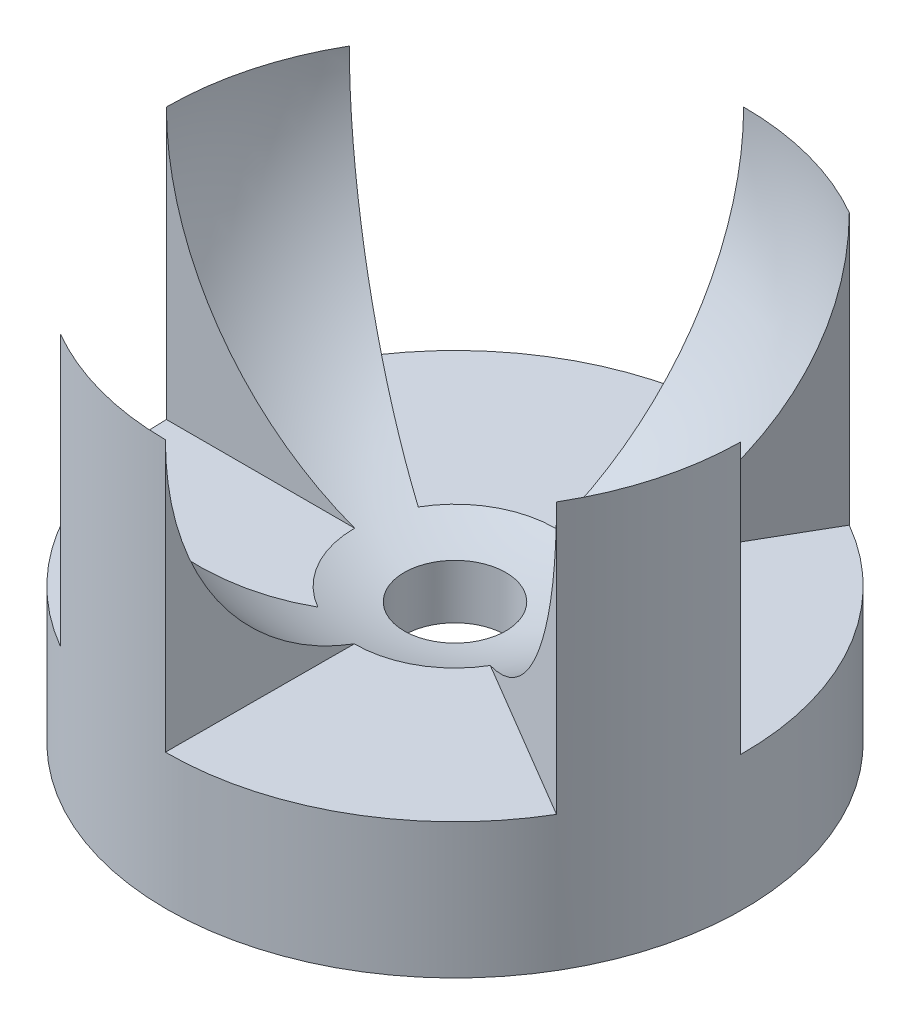
ISO-10303-21;
HEADER;
FILE_DESCRIPTION(('STEP AP214'),'2;1');
FILE_NAME('part.step','',(''),(''),'','','');
FILE_SCHEMA(('AUTOMOTIVE_DESIGN { 1 0 10303 214 1 1 1 1 }'));
ENDSEC;
DATA;
#1=APPLICATION_CONTEXT('core data for automotive mechanical design processes');
#2=APPLICATION_PROTOCOL_DEFINITION('international standard','automotive_design',2000,#1);
#3=PRODUCT_CONTEXT('',#1,'mechanical');
#4=PRODUCT('Part','Part','',(#3));
#5=PRODUCT_RELATED_PRODUCT_CATEGORY('part','',(#4));
#6=PRODUCT_DEFINITION_FORMATION('','',#4);
#7=PRODUCT_DEFINITION_CONTEXT('part definition',#1,'design');
#8=PRODUCT_DEFINITION('design','',#6,#7);
#9=PRODUCT_DEFINITION_SHAPE('','',#8);
#10=(LENGTH_UNIT() NAMED_UNIT(*) SI_UNIT(.MILLI.,.METRE.));
#11=(NAMED_UNIT(*) PLANE_ANGLE_UNIT() SI_UNIT($,.RADIAN.));
#12=(NAMED_UNIT(*) SI_UNIT($,.STERADIAN.) SOLID_ANGLE_UNIT());
#13=UNCERTAINTY_MEASURE_WITH_UNIT(LENGTH_MEASURE(1.E-05),#10,'distance_accuracy_value','');
#14=(GEOMETRIC_REPRESENTATION_CONTEXT(3) GLOBAL_UNCERTAINTY_ASSIGNED_CONTEXT((#13)) GLOBAL_UNIT_ASSIGNED_CONTEXT((#10,
#11,#12)) REPRESENTATION_CONTEXT('',''));
#15=CARTESIAN_POINT('',(0.,0.,0.));
#16=DIRECTION('',(0.,0.,1.));
#17=DIRECTION('',(1.,0.,0.));
#18=AXIS2_PLACEMENT_3D('',#15,#16,#17);
#19=CARTESIAN_POINT('',(0.,40.,0.));
#20=DIRECTION('',(0.,1.,0.));
#21=DIRECTION('',(0.,0.,1.));
#22=AXIS2_PLACEMENT_3D('',#19,#20,#21);
#23=PLANE('',#22);
#24=CARTESIAN_POINT('',(0.,40.,0.));
#25=DIRECTION('',(0.,1.,0.));
#26=DIRECTION('',(0.,0.,1.));
#27=AXIS2_PLACEMENT_3D('',#24,#25,#26);
#28=CIRCLE('',#27,29.6699868770734);
#29=CARTESIAN_POINT('',(29.669074385938,40.,0.232693720123943));
#30=VERTEX_POINT('',#29);
#31=CARTESIAN_POINT('',(14.8349934385367,40.,-25.6949623654964));
#32=VERTEX_POINT('',#31);
#33=EDGE_CURVE('E227',#30,#32,#28,.T.);
#34=ORIENTED_EDGE('',*,*,#33,.F.);
#35=DIRECTION('',(0.999930027740241,0.,0.0118296079140797));
#36=VECTOR('',#35,1.);
#37=CARTESIAN_POINT('',(0.00139939623400857,40.,-0.118287801696819));
#38=LINE('',#37,#36);
#39=CARTESIAN_POINT('',(85.3200686644835,40.,0.89106923049006));
#40=VERTEX_POINT('',#39);
#41=EDGE_CURVE('E36',#30,#40,#38,.T.);
#42=ORIENTED_EDGE('',*,*,#41,.T.);
#43=CARTESIAN_POINT('',(0.,40.,0.));
#44=DIRECTION('',(0.,1.,0.));
#45=DIRECTION('',(0.,0.,1.));
#46=AXIS2_PLACEMENT_3D('',#43,#44,#45);
#47=CIRCLE('',#46,85.3247216302855);
#48=CARTESIAN_POINT('',(42.6623608151428,40.,-73.8933765026628));
#49=VERTEX_POINT('',#48);
#50=EDGE_CURVE('E11',#40,#49,#47,.T.);
#51=ORIENTED_EDGE('',*,*,#50,.T.);
#52=DIRECTION('',(0.500000000000001,0.,-0.866025403784438));
#53=VECTOR('',#52,1.);
#54=CARTESIAN_POINT('',(5.,40.,-8.66025403784439));
#55=LINE('',#54,#53);
#56=EDGE_CURVE('E50',#32,#49,#55,.T.);
#57=ORIENTED_EDGE('',*,*,#56,.F.);
#58=EDGE_LOOP('',(#34,#42,#51,#57));
#59=FACE_BOUND('',#58,.T.);
#60=ADVANCED_FACE('F32',(#59),#23,.T.);
#61=CARTESIAN_POINT('',(0.,40.,-29.6699868770734));
#62=VERTEX_POINT('',#61);
#63=CARTESIAN_POINT('',(-25.6949623654964,40.,-14.8349934385367));
#64=VERTEX_POINT('',#63);
#65=EDGE_CURVE('E232',#62,#64,#28,.T.);
#66=ORIENTED_EDGE('',*,*,#65,.F.);
#67=DIRECTION('',(0.,0.,-1.));
#68=VECTOR('',#67,1.);
#69=CARTESIAN_POINT('',(0.,40.,-10.));
#70=LINE('',#69,#68);
#71=CARTESIAN_POINT('',(0.,40.,-85.3247216302855));
#72=VERTEX_POINT('',#71);
#73=EDGE_CURVE('E210',#62,#72,#70,.T.);
#74=ORIENTED_EDGE('',*,*,#73,.T.);
#75=CARTESIAN_POINT('',(-73.8933765026628,40.,-42.6623608151428));
#76=VERTEX_POINT('',#75);
#77=EDGE_CURVE('E42',#72,#76,#47,.T.);
#78=ORIENTED_EDGE('',*,*,#77,.T.);
#79=DIRECTION('',(0.866025403784438,0.,0.500000000000001));
#80=VECTOR('',#79,1.);
#81=CARTESIAN_POINT('',(-73.8933765026627,40.,-42.6623608151428));
#82=LINE('',#81,#80);
#83=EDGE_CURVE('E188',#76,#64,#82,.T.);
#84=ORIENTED_EDGE('',*,*,#83,.T.);
#85=EDGE_LOOP('',(#66,#74,#78,#84));
#86=FACE_BOUND('',#85,.T.);
#87=ADVANCED_FACE('F279',(#86),#23,.T.);
#88=CARTESIAN_POINT('',(-29.6699868770734,40.,0.));
#89=VERTEX_POINT('',#88);
#90=CARTESIAN_POINT('',(-14.9230697733276,40.,25.6439097999136));
#91=VERTEX_POINT('',#90);
#92=EDGE_CURVE('E222',#89,#91,#28,.T.);
#93=ORIENTED_EDGE('',*,*,#92,.F.);
#94=DIRECTION('',(-1.,0.,0.));
#95=VECTOR('',#94,1.);
#96=CARTESIAN_POINT('',(-10.,40.,0.));
#97=LINE('',#96,#95);
#98=CARTESIAN_POINT('',(-85.3247216302855,40.,0.));
#99=VERTEX_POINT('',#98);
#100=EDGE_CURVE('E178',#89,#99,#97,.T.);
#101=ORIENTED_EDGE('',*,*,#100,.T.);
#102=CARTESIAN_POINT('',(-42.9156500659734,40.,73.7465599245187));
#103=VERTEX_POINT('',#102);
#104=EDGE_CURVE('E164',#99,#103,#47,.T.);
#105=ORIENTED_EDGE('',*,*,#104,.T.);
#106=DIRECTION('',(0.502968532987757,0.,-0.864304723361005));
#107=VECTOR('',#106,1.);
#108=CARTESIAN_POINT('',(0.,40.,0.));
#109=LINE('',#108,#107);
#110=EDGE_CURVE('E176',#103,#91,#109,.T.);
#111=ORIENTED_EDGE('',*,*,#110,.T.);
#112=EDGE_LOOP('',(#93,#101,#105,#111));
#113=FACE_BOUND('',#112,.T.);
#114=ADVANCED_FACE('F174',(#113),#23,.T.);
#115=CARTESIAN_POINT('',(-0.101802626192548,40.,29.6698122257456));
#116=VERTEX_POINT('',#115);
#117=CARTESIAN_POINT('',(25.5386352927101,40.,15.1025239172679));
#118=VERTEX_POINT('',#117);
#119=EDGE_CURVE('E131',#116,#118,#28,.T.);
#120=ORIENTED_EDGE('',*,*,#119,.F.);
#121=DIRECTION('',(0.0034311651910845,0.,-0.99999411353539));
#122=VECTOR('',#121,1.);
#123=CARTESIAN_POINT('',(0.,40.,0.));
#124=LINE('',#123,#122);
#125=CARTESIAN_POINT('',(-0.29276321479681,40.,85.3242193693313));
#126=VERTEX_POINT('',#125);
#127=EDGE_CURVE('E192',#126,#116,#124,.T.);
#128=ORIENTED_EDGE('',*,*,#127,.F.);
#129=CARTESIAN_POINT('',(73.4438123008303,40.,43.4317229223769));
#130=VERTEX_POINT('',#129);
#131=EDGE_CURVE('E162',#126,#130,#47,.T.);
#132=ORIENTED_EDGE('',*,*,#131,.T.);
#133=DIRECTION('',(-0.860756541569095,0.,-0.509016872162418));
#134=VECTOR('',#133,1.);
#135=CARTESIAN_POINT('',(0.,40.,0.));
#136=LINE('',#135,#134);
#137=EDGE_CURVE('E140',#130,#118,#136,.T.);
#138=ORIENTED_EDGE('',*,*,#137,.T.);
#139=EDGE_LOOP('',(#120,#128,#132,#138));
#140=FACE_BOUND('',#139,.T.);
#141=ADVANCED_FACE('F271',(#140),#23,.T.);
#142=CARTESIAN_POINT('',(0.,40.,0.));
#143=DIRECTION('',(0.,-1.,0.));
#144=DIRECTION('',(0.,0.,-1.));
#145=AXIS2_PLACEMENT_3D('',#142,#143,#144);
#146=CYLINDRICAL_SURFACE('',#145,85.3247216302855);
#147=ORIENTED_EDGE('',*,*,#50,.F.);
#148=DIRECTION('',(0.,-1.,0.));
#149=VECTOR('',#148,1.);
#150=CARTESIAN_POINT('',(85.3200686644835,120.,0.89106923049006));
#151=LINE('',#150,#149);
#152=CARTESIAN_POINT('',(85.3200686644835,120.,0.89106923049006));
#153=VERTEX_POINT('',#152);
#154=EDGE_CURVE('E143',#153,#40,#151,.T.);
#155=ORIENTED_EDGE('',*,*,#154,.F.);
#156=CARTESIAN_POINT('',(0.,120.,0.));
#157=DIRECTION('',(0.,1.,0.));
#158=DIRECTION('',(0.,0.,1.));
#159=AXIS2_PLACEMENT_3D('',#156,#157,#158);
#160=CIRCLE('',#159,85.3247216302855);
#161=CARTESIAN_POINT('',(73.4438123008303,120.,43.4317229223769));
#162=VERTEX_POINT('',#161);
#163=EDGE_CURVE('E128',#162,#153,#160,.T.);
#164=ORIENTED_EDGE('',*,*,#163,.F.);
#165=DIRECTION('',(0.,-1.,0.));
#166=VECTOR('',#165,1.);
#167=CARTESIAN_POINT('',(73.4438123008302,120.,43.4317229223769));
#168=LINE('',#167,#166);
#169=EDGE_CURVE('E138',#162,#130,#168,.T.);
#170=ORIENTED_EDGE('',*,*,#169,.T.);
#171=ORIENTED_EDGE('',*,*,#131,.F.);
#172=DIRECTION('',(0.,-1.,0.));
#173=VECTOR('',#172,1.);
#174=CARTESIAN_POINT('',(-0.29276321479681,120.,85.3242193693313));
#175=LINE('',#174,#173);
#176=CARTESIAN_POINT('',(-0.29276321479681,120.,85.3242193693313));
#177=VERTEX_POINT('',#176);
#178=EDGE_CURVE('E187',#177,#126,#175,.T.);
#179=ORIENTED_EDGE('',*,*,#178,.F.);
#180=CARTESIAN_POINT('',(0.,120.,0.));
#181=DIRECTION('',(0.,1.,0.));
#182=DIRECTION('',(0.,0.,1.));
#183=AXIS2_PLACEMENT_3D('',#180,#181,#182);
#184=CIRCLE('',#183,85.3247216302855);
#185=CARTESIAN_POINT('',(-42.9156500659734,120.,73.7465599245187));
#186=VERTEX_POINT('',#185);
#187=EDGE_CURVE('E154',#186,#177,#184,.T.);
#188=ORIENTED_EDGE('',*,*,#187,.F.);
#189=DIRECTION('',(0.,-1.,0.));
#190=VECTOR('',#189,1.);
#191=CARTESIAN_POINT('',(-42.9156500659734,120.,73.7465599245187));
#192=LINE('',#191,#190);
#193=EDGE_CURVE('E183',#186,#103,#192,.T.);
#194=ORIENTED_EDGE('',*,*,#193,.T.);
#195=ORIENTED_EDGE('',*,*,#104,.F.);
#196=DIRECTION('',(0.,-1.,0.));
#197=VECTOR('',#196,1.);
#198=CARTESIAN_POINT('',(-85.3247216302855,120.,0.));
#199=LINE('',#198,#197);
#200=CARTESIAN_POINT('',(-85.3247216302855,120.,0.));
#201=VERTEX_POINT('',#200);
#202=EDGE_CURVE('E201',#201,#99,#199,.T.);
#203=ORIENTED_EDGE('',*,*,#202,.F.);
#204=CARTESIAN_POINT('',(0.,120.,0.));
#205=DIRECTION('',(0.,-1.,0.));
#206=DIRECTION('',(0.,0.,-1.));
#207=AXIS2_PLACEMENT_3D('',#204,#205,#206);
#208=CIRCLE('',#207,85.3247216302855);
#209=CARTESIAN_POINT('',(-73.8933765026628,120.,-42.6623608151428));
#210=VERTEX_POINT('',#209);
#211=EDGE_CURVE('E198',#201,#210,#208,.T.);
#212=ORIENTED_EDGE('',*,*,#211,.T.);
#213=DIRECTION('',(0.,-1.,0.));
#214=VECTOR('',#213,1.);
#215=CARTESIAN_POINT('',(-73.8933765026628,120.,-42.6623608151428));
#216=LINE('',#215,#214);
#217=EDGE_CURVE('E205',#210,#76,#216,.T.);
#218=ORIENTED_EDGE('',*,*,#217,.T.);
#219=ORIENTED_EDGE('',*,*,#77,.F.);
#220=DIRECTION('',(0.,-1.,0.));
#221=VECTOR('',#220,1.);
#222=CARTESIAN_POINT('',(0.,120.,-85.3247216302855));
#223=LINE('',#222,#221);
#224=CARTESIAN_POINT('',(0.,120.,-85.3247216302855));
#225=VERTEX_POINT('',#224);
#226=EDGE_CURVE('E211',#225,#72,#223,.T.);
#227=ORIENTED_EDGE('',*,*,#226,.F.);
#228=CARTESIAN_POINT('',(0.,120.,0.));
#229=DIRECTION('',(0.,-1.,0.));
#230=DIRECTION('',(0.,0.,-1.));
#231=AXIS2_PLACEMENT_3D('',#228,#229,#230);
#232=CIRCLE('',#231,85.3247216302855);
#233=CARTESIAN_POINT('',(42.6623608151428,120.,-73.8933765026627));
#234=VERTEX_POINT('',#233);
#235=EDGE_CURVE('E207',#225,#234,#232,.T.);
#236=ORIENTED_EDGE('',*,*,#235,.T.);
#237=DIRECTION('',(0.,-1.,0.));
#238=VECTOR('',#237,1.);
#239=CARTESIAN_POINT('',(42.6623608151428,120.,-73.8933765026627));
#240=LINE('',#239,#238);
#241=EDGE_CURVE('E135',#234,#49,#240,.T.);
#242=ORIENTED_EDGE('',*,*,#241,.T.);
#243=EDGE_LOOP('',(#147,#155,#164,#170,#171,#179,#188,#194,#195,#203,#212,#218,#219,#227,#236,#242));
#244=FACE_BOUND('',#243,.T.);
#245=CARTESIAN_POINT('',(0.,0.,0.));
#246=DIRECTION('',(0.,1.,0.));
#247=DIRECTION('',(0.,0.,1.));
#248=AXIS2_PLACEMENT_3D('',#245,#246,#247);
#249=CIRCLE('',#248,85.3247216302855);
#250=CARTESIAN_POINT('',(0.,0.,85.3247216302855));
#251=VERTEX_POINT('',#250);
#252=EDGE_CURVE('E142',#251,#251,#249,.T.);
#253=ORIENTED_EDGE('',*,*,#252,.T.);
#254=EDGE_LOOP('',(#253));
#255=FACE_BOUND('',#254,.T.);
#256=ADVANCED_FACE('F34',(#244,#255),#146,.T.);
#257=CARTESIAN_POINT('',(0.,0.,0.));
#258=DIRECTION('',(0.,1.,0.));
#259=DIRECTION('',(0.,0.,1.));
#260=AXIS2_PLACEMENT_3D('',#257,#258,#259);
#261=PLANE('',#260);
#262=CARTESIAN_POINT('',(0.,0.,0.));
#263=DIRECTION('',(0.,-1.,0.));
#264=DIRECTION('',(0.,0.,-1.));
#265=AXIS2_PLACEMENT_3D('',#262,#263,#264);
#266=CIRCLE('',#265,50.);
#267=CARTESIAN_POINT('',(0.,0.,-50.));
#268=VERTEX_POINT('',#267);
#269=EDGE_CURVE('E237',#268,#268,#266,.T.);
#270=ORIENTED_EDGE('',*,*,#269,.F.);
#271=EDGE_LOOP('',(#270));
#272=FACE_BOUND('',#271,.T.);
#273=ORIENTED_EDGE('',*,*,#252,.F.);
#274=EDGE_LOOP('',(#273));
#275=FACE_BOUND('',#274,.T.);
#276=ADVANCED_FACE('F264',(#272,#275),#261,.F.);
#277=CARTESIAN_POINT('',(0.00139939623400857,120.,-0.118287801696819));
#278=DIRECTION('',(0.0118296079140797,0.,-0.999930027740241));
#279=DIRECTION('',(-0.999930027740241,0.,-0.0118296079140797));
#280=AXIS2_PLACEMENT_3D('',#277,#278,#279);
#281=PLANE('',#280);
#282=CARTESIAN_POINT('',(0.00139939623400857,120.,-0.118287801696819));
#283=DIRECTION('',(0.0118296079140797,0.,-0.999930027740241));
#284=DIRECTION('',(-0.999930027740241,0.,-0.0118296079140797));
#285=AXIS2_PLACEMENT_3D('',#282,#283,#284);
#286=CIRCLE('',#285,85.3246396260972);
#287=EDGE_CURVE('E225',#153,#30,#286,.T.);
#288=ORIENTED_EDGE('',*,*,#287,.F.);
#289=ORIENTED_EDGE('',*,*,#154,.T.);
#290=ORIENTED_EDGE('',*,*,#41,.F.);
#291=EDGE_LOOP('',(#288,#289,#290));
#292=FACE_BOUND('',#291,.T.);
#293=ADVANCED_FACE('F267',(#292),#281,.T.);
#294=CARTESIAN_POINT('',(0.,120.,0.));
#295=DIRECTION('',(-0.509016872162418,0.,0.860756541569095));
#296=DIRECTION('',(0.860756541569095,0.,0.509016872162418));
#297=AXIS2_PLACEMENT_3D('',#294,#295,#296);
#298=PLANE('',#297);
#299=CARTESIAN_POINT('',(0.,120.,0.));
#300=DIRECTION('',(-0.509016872162418,0.,0.860756541569095));
#301=DIRECTION('',(0.860756541569095,0.,0.509016872162418));
#302=AXIS2_PLACEMENT_3D('',#299,#300,#301);
#303=CIRCLE('',#302,85.3247216302855);
#304=EDGE_CURVE('E124',#118,#162,#303,.T.);
#305=ORIENTED_EDGE('',*,*,#304,.F.);
#306=ORIENTED_EDGE('',*,*,#137,.F.);
#307=ORIENTED_EDGE('',*,*,#169,.F.);
#308=EDGE_LOOP('',(#305,#306,#307));
#309=FACE_BOUND('',#308,.T.);
#310=ADVANCED_FACE('F139',(#309),#298,.T.);
#311=CARTESIAN_POINT('',(0.,120.,0.));
#312=DIRECTION('',(-0.99999411353539,0.,-0.0034311651910845));
#313=DIRECTION('',(-0.0034311651910845,0.,0.99999411353539));
#314=AXIS2_PLACEMENT_3D('',#311,#312,#313);
#315=PLANE('',#314);
#316=ORIENTED_EDGE('',*,*,#127,.T.);
#317=CARTESIAN_POINT('',(0.,120.,0.));
#318=DIRECTION('',(-0.99999411353539,0.,-0.0034311651910845));
#319=DIRECTION('',(-0.0034311651910845,0.,0.99999411353539));
#320=AXIS2_PLACEMENT_3D('',#317,#318,#319);
#321=CIRCLE('',#320,85.3247216302855);
#322=EDGE_CURVE('E218',#116,#177,#321,.T.);
#323=ORIENTED_EDGE('',*,*,#322,.T.);
#324=ORIENTED_EDGE('',*,*,#178,.T.);
#325=EDGE_LOOP('',(#316,#323,#324));
#326=FACE_BOUND('',#325,.T.);
#327=ADVANCED_FACE('F291',(#326),#315,.F.);
#328=CARTESIAN_POINT('',(0.,120.,0.));
#329=DIRECTION('',(-0.864304723361005,0.,-0.502968532987757));
#330=DIRECTION('',(-0.502968532987757,0.,0.864304723361005));
#331=AXIS2_PLACEMENT_3D('',#328,#329,#330);
#332=PLANE('',#331);
#333=CARTESIAN_POINT('',(0.,120.,0.));
#334=DIRECTION('',(-0.864304723361005,0.,-0.502968532987757));
#335=DIRECTION('',(-0.502968532987757,0.,0.864304723361005));
#336=AXIS2_PLACEMENT_3D('',#333,#334,#335);
#337=CIRCLE('',#336,85.3247216302855);
#338=EDGE_CURVE('E191',#91,#186,#337,.T.);
#339=ORIENTED_EDGE('',*,*,#338,.F.);
#340=ORIENTED_EDGE('',*,*,#110,.F.);
#341=ORIENTED_EDGE('',*,*,#193,.F.);
#342=EDGE_LOOP('',(#339,#340,#341));
#343=FACE_BOUND('',#342,.T.);
#344=ADVANCED_FACE('F190',(#343),#332,.T.);
#345=CARTESIAN_POINT('',(-73.8933765026627,120.,-42.6623608151428));
#346=DIRECTION('',(0.500000000000001,0.,-0.866025403784438));
#347=DIRECTION('',(-0.866025403784438,0.,-0.500000000000001));
#348=AXIS2_PLACEMENT_3D('',#345,#346,#347);
#349=PLANE('',#348);
#350=CARTESIAN_POINT('',(0.,120.,0.));
#351=DIRECTION('',(0.500000000000001,0.,-0.866025403784438));
#352=DIRECTION('',(-0.866025403784438,0.,-0.500000000000001));
#353=AXIS2_PLACEMENT_3D('',#350,#351,#352);
#354=CIRCLE('',#353,85.3247216302855);
#355=EDGE_CURVE('E230',#64,#210,#354,.T.);
#356=ORIENTED_EDGE('',*,*,#355,.F.);
#357=ORIENTED_EDGE('',*,*,#83,.F.);
#358=ORIENTED_EDGE('',*,*,#217,.F.);
#359=EDGE_LOOP('',(#356,#357,#358));
#360=FACE_BOUND('',#359,.T.);
#361=ADVANCED_FACE('F294',(#360),#349,.T.);
#362=CARTESIAN_POINT('',(-10.,120.,0.));
#363=DIRECTION('',(0.,0.,1.));
#364=DIRECTION('',(1.,0.,0.));
#365=AXIS2_PLACEMENT_3D('',#362,#363,#364);
#366=PLANE('',#365);
#367=CARTESIAN_POINT('',(0.,120.,0.));
#368=DIRECTION('',(0.,0.,1.));
#369=DIRECTION('',(1.,0.,0.));
#370=AXIS2_PLACEMENT_3D('',#367,#368,#369);
#371=CIRCLE('',#370,85.3247216302855);
#372=EDGE_CURVE('E223',#201,#89,#371,.T.);
#373=ORIENTED_EDGE('',*,*,#372,.F.);
#374=ORIENTED_EDGE('',*,*,#202,.T.);
#375=ORIENTED_EDGE('',*,*,#100,.F.);
#376=EDGE_LOOP('',(#373,#374,#375));
#377=FACE_BOUND('',#376,.T.);
#378=ADVANCED_FACE('F298',(#377),#366,.T.);
#379=CARTESIAN_POINT('',(5.,120.,-8.66025403784439));
#380=DIRECTION('',(-0.866025403784438,0.,-0.500000000000001));
#381=DIRECTION('',(-0.500000000000001,0.,0.866025403784438));
#382=AXIS2_PLACEMENT_3D('',#379,#380,#381);
#383=PLANE('',#382);
#384=ORIENTED_EDGE('',*,*,#241,.F.);
#385=CARTESIAN_POINT('',(0.,120.,0.));
#386=DIRECTION('',(-0.866025403784438,0.,-0.500000000000001));
#387=DIRECTION('',(-0.500000000000001,0.,0.866025403784438));
#388=AXIS2_PLACEMENT_3D('',#385,#386,#387);
#389=CIRCLE('',#388,85.3247216302855);
#390=EDGE_CURVE('E228',#234,#32,#389,.T.);
#391=ORIENTED_EDGE('',*,*,#390,.T.);
#392=ORIENTED_EDGE('',*,*,#56,.T.);
#393=EDGE_LOOP('',(#384,#391,#392));
#394=FACE_BOUND('',#393,.T.);
#395=ADVANCED_FACE('F301',(#394),#383,.F.);
#396=CARTESIAN_POINT('',(0.,120.,-10.));
#397=DIRECTION('',(-1.,0.,0.));
#398=DIRECTION('',(0.,0.,1.));
#399=AXIS2_PLACEMENT_3D('',#396,#397,#398);
#400=PLANE('',#399);
#401=CARTESIAN_POINT('',(0.,120.,0.));
#402=DIRECTION('',(-1.,0.,0.));
#403=DIRECTION('',(0.,0.,1.));
#404=AXIS2_PLACEMENT_3D('',#401,#402,#403);
#405=CIRCLE('',#404,85.3247216302855);
#406=EDGE_CURVE('E234',#225,#62,#405,.T.);
#407=ORIENTED_EDGE('',*,*,#406,.F.);
#408=ORIENTED_EDGE('',*,*,#226,.T.);
#409=ORIENTED_EDGE('',*,*,#73,.F.);
#410=EDGE_LOOP('',(#407,#408,#409));
#411=FACE_BOUND('',#410,.T.);
#412=ADVANCED_FACE('F306',(#411),#400,.T.);
#413=CARTESIAN_POINT('',(0.,120.,0.));
#414=DIRECTION('',(0.,1.,0.));
#415=DIRECTION('',(0.500000000000001,0.,-0.866025403784438));
#416=AXIS2_PLACEMENT_3D('',#413,#414,#415);
#417=SPHERICAL_SURFACE('',#416,85.3247216302855);
#418=CARTESIAN_POINT('',(0.,36.0041184266413,0.));
#419=DIRECTION('',(0.,1.,0.));
#420=DIRECTION('',(0.,0.,1.));
#421=AXIS2_PLACEMENT_3D('',#418,#419,#420);
#422=CIRCLE('',#421,15.);
#423=CARTESIAN_POINT('',(0.,36.0041184266413,15.));
#424=VERTEX_POINT('',#423);
#425=EDGE_CURVE('E240',#424,#424,#422,.F.);
#426=ORIENTED_EDGE('',*,*,#425,.T.);
#427=EDGE_LOOP('',(#426));
#428=FACE_BOUND('',#427,.T.);
#429=ORIENTED_EDGE('',*,*,#304,.T.);
#430=ORIENTED_EDGE('',*,*,#163,.T.);
#431=ORIENTED_EDGE('',*,*,#287,.T.);
#432=ORIENTED_EDGE('',*,*,#33,.T.);
#433=ORIENTED_EDGE('',*,*,#390,.F.);
#434=ORIENTED_EDGE('',*,*,#235,.F.);
#435=ORIENTED_EDGE('',*,*,#406,.T.);
#436=ORIENTED_EDGE('',*,*,#65,.T.);
#437=ORIENTED_EDGE('',*,*,#355,.T.);
#438=ORIENTED_EDGE('',*,*,#211,.F.);
#439=ORIENTED_EDGE('',*,*,#372,.T.);
#440=ORIENTED_EDGE('',*,*,#92,.T.);
#441=ORIENTED_EDGE('',*,*,#338,.T.);
#442=ORIENTED_EDGE('',*,*,#187,.T.);
#443=ORIENTED_EDGE('',*,*,#322,.F.);
#444=ORIENTED_EDGE('',*,*,#119,.T.);
#445=EDGE_LOOP('',(#429,#430,#431,#432,#433,#434,#435,#436,#437,#438,#439,#440,#441,#442,#443,#444));
#446=FACE_BOUND('',#445,.T.);
#447=ADVANCED_FACE('F126',(#428,#446),#417,.F.);
#448=CARTESIAN_POINT('',(0.,20.,0.));
#449=DIRECTION('',(0.,-1.,0.));
#450=DIRECTION('',(0.,0.,-1.));
#451=AXIS2_PLACEMENT_3D('',#448,#449,#450);
#452=CYLINDRICAL_SURFACE('',#451,50.);
#453=CARTESIAN_POINT('',(0.,20.,0.));
#454=DIRECTION('',(0.,-1.,0.));
#455=DIRECTION('',(0.,0.,-1.));
#456=AXIS2_PLACEMENT_3D('',#453,#454,#455);
#457=CIRCLE('',#456,50.);
#458=CARTESIAN_POINT('',(0.,20.,-50.));
#459=VERTEX_POINT('',#458);
#460=EDGE_CURVE('E236',#459,#459,#457,.T.);
#461=ORIENTED_EDGE('',*,*,#460,.F.);
#462=EDGE_LOOP('',(#461));
#463=FACE_BOUND('',#462,.T.);
#464=ORIENTED_EDGE('',*,*,#269,.T.);
#465=EDGE_LOOP('',(#464));
#466=FACE_BOUND('',#465,.T.);
#467=ADVANCED_FACE('F255',(#463,#466),#452,.F.);
#468=CARTESIAN_POINT('',(0.,20.,0.));
#469=DIRECTION('',(0.,-1.,0.));
#470=DIRECTION('',(0.,0.,-1.));
#471=AXIS2_PLACEMENT_3D('',#468,#469,#470);
#472=PLANE('',#471);
#473=CARTESIAN_POINT('',(0.,20.,0.));
#474=DIRECTION('',(0.,-1.,0.));
#475=DIRECTION('',(0.,0.,-1.));
#476=AXIS2_PLACEMENT_3D('',#473,#474,#475);
#477=CIRCLE('',#476,15.);
#478=CARTESIAN_POINT('',(0.,20.,-15.));
#479=VERTEX_POINT('',#478);
#480=EDGE_CURVE('E245',#479,#479,#477,.T.);
#481=ORIENTED_EDGE('',*,*,#480,.F.);
#482=EDGE_LOOP('',(#481));
#483=FACE_BOUND('',#482,.T.);
#484=ORIENTED_EDGE('',*,*,#460,.T.);
#485=EDGE_LOOP('',(#484));
#486=FACE_BOUND('',#485,.T.);
#487=ADVANCED_FACE('F252',(#483,#486),#472,.T.);
#488=CARTESIAN_POINT('',(0.,80.,0.));
#489=DIRECTION('',(0.,-1.,0.));
#490=DIRECTION('',(0.,0.,-1.));
#491=AXIS2_PLACEMENT_3D('',#488,#489,#490);
#492=CYLINDRICAL_SURFACE('',#491,15.);
#493=ORIENTED_EDGE('',*,*,#480,.T.);
#494=EDGE_LOOP('',(#493));
#495=FACE_BOUND('',#494,.T.);
#496=ORIENTED_EDGE('',*,*,#425,.F.);
#497=EDGE_LOOP('',(#496));
#498=FACE_BOUND('',#497,.T.);
#499=ADVANCED_FACE('F249',(#495,#498),#492,.F.);
#500=CLOSED_SHELL('',(#60,#87,#114,#141,#256,#276,#293,#310,#327,#344,#361,#378,#395,#412,#447,
#467,#487,#499));
#501=MANIFOLD_SOLID_BREP('B2',#500);
#502=ADVANCED_BREP_SHAPE_REPRESENTATION('',(#18,#501),#14);
#503=SHAPE_DEFINITION_REPRESENTATION(#9,#502);
ENDSEC;
END-ISO-10303-21;
